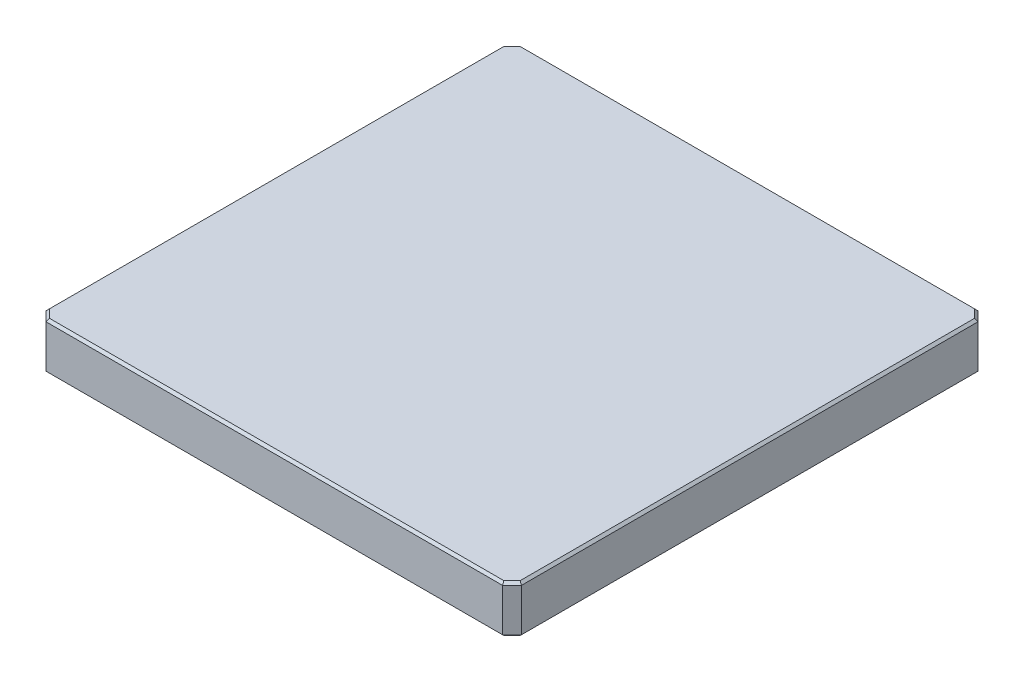
ISO-10303-21;
HEADER;
FILE_DESCRIPTION(('STEP AP214'),'2;1');
FILE_NAME('part.step','',(''),(''),'','','');
FILE_SCHEMA(('AUTOMOTIVE_DESIGN { 1 0 10303 214 1 1 1 1 }'));
ENDSEC;
DATA;
#1=APPLICATION_CONTEXT('core data for automotive mechanical design processes');
#2=APPLICATION_PROTOCOL_DEFINITION('international standard','automotive_design',2000,#1);
#3=PRODUCT_CONTEXT('',#1,'mechanical');
#4=PRODUCT('Part','Part','',(#3));
#5=PRODUCT_RELATED_PRODUCT_CATEGORY('part','',(#4));
#6=PRODUCT_DEFINITION_FORMATION('','',#4);
#7=PRODUCT_DEFINITION_CONTEXT('part definition',#1,'design');
#8=PRODUCT_DEFINITION('design','',#6,#7);
#9=PRODUCT_DEFINITION_SHAPE('','',#8);
#10=(LENGTH_UNIT() NAMED_UNIT(*) SI_UNIT(.MILLI.,.METRE.));
#11=(NAMED_UNIT(*) PLANE_ANGLE_UNIT() SI_UNIT($,.RADIAN.));
#12=(NAMED_UNIT(*) SI_UNIT($,.STERADIAN.) SOLID_ANGLE_UNIT());
#13=UNCERTAINTY_MEASURE_WITH_UNIT(LENGTH_MEASURE(1.E-05),#10,'distance_accuracy_value','');
#14=(GEOMETRIC_REPRESENTATION_CONTEXT(3) GLOBAL_UNCERTAINTY_ASSIGNED_CONTEXT((#13)) GLOBAL_UNIT_ASSIGNED_CONTEXT((#10,
#11,#12)) REPRESENTATION_CONTEXT('',''));
#15=CARTESIAN_POINT('',(0.,0.,0.));
#16=DIRECTION('',(0.,0.,1.));
#17=DIRECTION('',(1.,0.,0.));
#18=AXIS2_PLACEMENT_3D('',#15,#16,#17);
#19=CARTESIAN_POINT('',(0.,10.,0.));
#20=DIRECTION('',(1.,0.,0.));
#21=DIRECTION('',(0.,0.,-1.));
#22=AXIS2_PLACEMENT_3D('',#19,#20,#21);
#23=PLANE('',#22);
#24=DIRECTION('',(0.,-1.,0.));
#25=VECTOR('',#24,1.);
#26=CARTESIAN_POINT('',(0.,10.,-98.));
#27=LINE('',#26,#25);
#28=CARTESIAN_POINT('',(0.,9.49999999999998,-98.));
#29=VERTEX_POINT('',#28);
#30=CARTESIAN_POINT('',(0.,0.5,-98.));
#31=VERTEX_POINT('',#30);
#32=EDGE_CURVE('E338',#29,#31,#27,.T.);
#33=ORIENTED_EDGE('',*,*,#32,.T.);
#34=DIRECTION('',(0.,0.,1.));
#35=VECTOR('',#34,1.);
#36=CARTESIAN_POINT('',(0.,0.5,-2.00000000000002));
#37=LINE('',#36,#35);
#38=CARTESIAN_POINT('',(0.,0.5,-2.00000000000002));
#39=VERTEX_POINT('',#38);
#40=EDGE_CURVE('E242',#31,#39,#37,.T.);
#41=ORIENTED_EDGE('',*,*,#40,.T.);
#42=DIRECTION('',(0.,1.,0.));
#43=VECTOR('',#42,1.);
#44=CARTESIAN_POINT('',(0.,10.,-2.00000000000002));
#45=LINE('',#44,#43);
#46=CARTESIAN_POINT('',(0.,9.49999999999999,-2.00000000000002));
#47=VERTEX_POINT('',#46);
#48=EDGE_CURVE('E288',#39,#47,#45,.T.);
#49=ORIENTED_EDGE('',*,*,#48,.T.);
#50=DIRECTION('',(0.,0.,-1.));
#51=VECTOR('',#50,1.);
#52=CARTESIAN_POINT('',(0.,9.49999999999999,0.));
#53=LINE('',#52,#51);
#54=EDGE_CURVE('E239',#47,#29,#53,.T.);
#55=ORIENTED_EDGE('',*,*,#54,.T.);
#56=EDGE_LOOP('',(#33,#41,#49,#55));
#57=FACE_BOUND('',#56,.T.);
#58=ADVANCED_FACE('F47',(#57),#23,.F.);
#59=CARTESIAN_POINT('',(0.,10.,0.));
#60=DIRECTION('',(0.,0.,-1.));
#61=DIRECTION('',(-1.,0.,0.));
#62=AXIS2_PLACEMENT_3D('',#59,#60,#61);
#63=PLANE('',#62);
#64=DIRECTION('',(0.,-1.,0.));
#65=VECTOR('',#64,1.);
#66=CARTESIAN_POINT('',(2.00000000000002,10.,0.));
#67=LINE('',#66,#65);
#68=CARTESIAN_POINT('',(2.00000000000002,9.49999999999999,0.));
#69=VERTEX_POINT('',#68);
#70=CARTESIAN_POINT('',(2.00000000000002,0.5,0.));
#71=VERTEX_POINT('',#70);
#72=EDGE_CURVE('E184',#69,#71,#67,.T.);
#73=ORIENTED_EDGE('',*,*,#72,.T.);
#74=DIRECTION('',(1.,0.,0.));
#75=VECTOR('',#74,1.);
#76=CARTESIAN_POINT('',(98.,0.5,0.));
#77=LINE('',#76,#75);
#78=CARTESIAN_POINT('',(98.,0.499999999999999,0.));
#79=VERTEX_POINT('',#78);
#80=EDGE_CURVE('E205',#71,#79,#77,.T.);
#81=ORIENTED_EDGE('',*,*,#80,.T.);
#82=DIRECTION('',(0.,1.,0.));
#83=VECTOR('',#82,1.);
#84=CARTESIAN_POINT('',(98.,10.,0.));
#85=LINE('',#84,#83);
#86=CARTESIAN_POINT('',(98.,9.49999999999999,0.));
#87=VERTEX_POINT('',#86);
#88=EDGE_CURVE('E359',#79,#87,#85,.T.);
#89=ORIENTED_EDGE('',*,*,#88,.T.);
#90=DIRECTION('',(-1.,0.,0.));
#91=VECTOR('',#90,1.);
#92=CARTESIAN_POINT('',(0.,9.49999999999999,0.));
#93=LINE('',#92,#91);
#94=EDGE_CURVE('E202',#87,#69,#93,.T.);
#95=ORIENTED_EDGE('',*,*,#94,.T.);
#96=EDGE_LOOP('',(#73,#81,#89,#95));
#97=FACE_BOUND('',#96,.T.);
#98=ADVANCED_FACE('F388',(#97),#63,.F.);
#99=CARTESIAN_POINT('',(100.,10.,0.));
#100=DIRECTION('',(-1.,0.,0.));
#101=DIRECTION('',(0.,0.,1.));
#102=AXIS2_PLACEMENT_3D('',#99,#100,#101);
#103=PLANE('',#102);
#104=DIRECTION('',(0.,-1.,0.));
#105=VECTOR('',#104,1.);
#106=CARTESIAN_POINT('',(100.,10.,-2.00000000000002));
#107=LINE('',#106,#105);
#108=CARTESIAN_POINT('',(100.,9.49999999999999,-2.00000000000002));
#109=VERTEX_POINT('',#108);
#110=CARTESIAN_POINT('',(100.,0.5,-2.00000000000002));
#111=VERTEX_POINT('',#110);
#112=EDGE_CURVE('E351',#109,#111,#107,.T.);
#113=ORIENTED_EDGE('',*,*,#112,.T.);
#114=DIRECTION('',(0.,0.,-1.));
#115=VECTOR('',#114,1.);
#116=CARTESIAN_POINT('',(100.,0.5,-98.));
#117=LINE('',#116,#115);
#118=CARTESIAN_POINT('',(100.,0.5,-98.));
#119=VERTEX_POINT('',#118);
#120=EDGE_CURVE('E217',#111,#119,#117,.T.);
#121=ORIENTED_EDGE('',*,*,#120,.T.);
#122=DIRECTION('',(0.,1.,0.));
#123=VECTOR('',#122,1.);
#124=CARTESIAN_POINT('',(100.,10.,-98.));
#125=LINE('',#124,#123);
#126=CARTESIAN_POINT('',(100.,9.49999999999999,-98.));
#127=VERTEX_POINT('',#126);
#128=EDGE_CURVE('E355',#119,#127,#125,.T.);
#129=ORIENTED_EDGE('',*,*,#128,.T.);
#130=DIRECTION('',(0.,0.,1.));
#131=VECTOR('',#130,1.);
#132=CARTESIAN_POINT('',(100.,9.49999999999999,0.));
#133=LINE('',#132,#131);
#134=EDGE_CURVE('E214',#127,#109,#133,.T.);
#135=ORIENTED_EDGE('',*,*,#134,.T.);
#136=EDGE_LOOP('',(#113,#121,#129,#135));
#137=FACE_BOUND('',#136,.T.);
#138=ADVANCED_FACE('F432',(#137),#103,.F.);
#139=CARTESIAN_POINT('',(0.,10.,-100.));
#140=DIRECTION('',(0.,0.,1.));
#141=DIRECTION('',(1.,0.,0.));
#142=AXIS2_PLACEMENT_3D('',#139,#140,#141);
#143=PLANE('',#142);
#144=DIRECTION('',(0.,-1.,0.));
#145=VECTOR('',#144,1.);
#146=CARTESIAN_POINT('',(98.,10.,-100.));
#147=LINE('',#146,#145);
#148=CARTESIAN_POINT('',(98.,9.49999999999999,-100.));
#149=VERTEX_POINT('',#148);
#150=CARTESIAN_POINT('',(98.,0.5,-100.));
#151=VERTEX_POINT('',#150);
#152=EDGE_CURVE('E341',#149,#151,#147,.T.);
#153=ORIENTED_EDGE('',*,*,#152,.T.);
#154=DIRECTION('',(-1.,0.,0.));
#155=VECTOR('',#154,1.);
#156=CARTESIAN_POINT('',(2.00000000000002,0.5,-100.));
#157=LINE('',#156,#155);
#158=CARTESIAN_POINT('',(2.00000000000002,0.500000000000004,-100.));
#159=VERTEX_POINT('',#158);
#160=EDGE_CURVE('E230',#151,#159,#157,.T.);
#161=ORIENTED_EDGE('',*,*,#160,.T.);
#162=DIRECTION('',(0.,1.,0.));
#163=VECTOR('',#162,1.);
#164=CARTESIAN_POINT('',(2.00000000000002,10.,-100.));
#165=LINE('',#164,#163);
#166=CARTESIAN_POINT('',(2.00000000000002,9.49999999999999,-100.));
#167=VERTEX_POINT('',#166);
#168=EDGE_CURVE('E347',#159,#167,#165,.T.);
#169=ORIENTED_EDGE('',*,*,#168,.T.);
#170=DIRECTION('',(1.,0.,0.));
#171=VECTOR('',#170,1.);
#172=CARTESIAN_POINT('',(0.,9.49999999999999,-100.));
#173=LINE('',#172,#171);
#174=EDGE_CURVE('E227',#167,#149,#173,.T.);
#175=ORIENTED_EDGE('',*,*,#174,.T.);
#176=EDGE_LOOP('',(#153,#161,#169,#175));
#177=FACE_BOUND('',#176,.T.);
#178=ADVANCED_FACE('F416',(#177),#143,.F.);
#179=CARTESIAN_POINT('',(0.,10.,0.));
#180=DIRECTION('',(0.,-1.,0.));
#181=DIRECTION('',(0.,0.,-1.));
#182=AXIS2_PLACEMENT_3D('',#179,#180,#181);
#183=PLANE('',#182);
#184=DIRECTION('',(0.,0.,-1.));
#185=VECTOR('',#184,1.);
#186=CARTESIAN_POINT('',(99.5,10.,0.));
#187=LINE('',#186,#185);
#188=CARTESIAN_POINT('',(99.5,10.,-2.2071067811866));
#189=VERTEX_POINT('',#188);
#190=CARTESIAN_POINT('',(99.5,10.,-97.7928932188134));
#191=VERTEX_POINT('',#190);
#192=EDGE_CURVE('E58',#189,#191,#187,.T.);
#193=ORIENTED_EDGE('',*,*,#192,.T.);
#194=DIRECTION('',(-0.707106781186545,0.,-0.70710678118655));
#195=VECTOR('',#194,1.);
#196=CARTESIAN_POINT('',(97.6464466094067,10.,-99.6464466094067));
#197=LINE('',#196,#195);
#198=CARTESIAN_POINT('',(97.7928932188134,10.,-99.5));
#199=VERTEX_POINT('',#198);
#200=EDGE_CURVE('E11',#191,#199,#197,.T.);
#201=ORIENTED_EDGE('',*,*,#200,.T.);
#202=DIRECTION('',(-1.,0.,0.));
#203=VECTOR('',#202,1.);
#204=CARTESIAN_POINT('',(0.,10.,-99.5));
#205=LINE('',#204,#203);
#206=CARTESIAN_POINT('',(2.20710678118657,10.,-99.5));
#207=VERTEX_POINT('',#206);
#208=EDGE_CURVE('E245',#199,#207,#205,.T.);
#209=ORIENTED_EDGE('',*,*,#208,.T.);
#210=DIRECTION('',(-0.70710678118655,0.,0.707106781186545));
#211=VECTOR('',#210,1.);
#212=CARTESIAN_POINT('',(0.353553390593281,10.,-97.6464466094067));
#213=LINE('',#212,#211);
#214=CARTESIAN_POINT('',(0.500000000000012,10.,-97.7928932188134));
#215=VERTEX_POINT('',#214);
#216=EDGE_CURVE('E248',#207,#215,#213,.T.);
#217=ORIENTED_EDGE('',*,*,#216,.T.);
#218=DIRECTION('',(0.,0.,1.));
#219=VECTOR('',#218,1.);
#220=CARTESIAN_POINT('',(0.500000000000014,10.,0.));
#221=LINE('',#220,#219);
#222=CARTESIAN_POINT('',(0.500000000000014,10.,-2.20710678118657));
#223=VERTEX_POINT('',#222);
#224=EDGE_CURVE('E251',#215,#223,#221,.T.);
#225=ORIENTED_EDGE('',*,*,#224,.T.);
#226=DIRECTION('',(0.707106781186548,0.,0.707106781186548));
#227=VECTOR('',#226,1.);
#228=CARTESIAN_POINT('',(2.3535533905933,10.,-0.353553390593284));
#229=LINE('',#228,#227);
#230=CARTESIAN_POINT('',(2.20710678118657,10.,-0.500000000000014));
#231=VERTEX_POINT('',#230);
#232=EDGE_CURVE('E254',#223,#231,#229,.T.);
#233=ORIENTED_EDGE('',*,*,#232,.T.);
#234=DIRECTION('',(1.,0.,0.));
#235=VECTOR('',#234,1.);
#236=CARTESIAN_POINT('',(0.,10.,-0.500000000000014));
#237=LINE('',#236,#235);
#238=CARTESIAN_POINT('',(97.7928932188134,10.,-0.500000000000014));
#239=VERTEX_POINT('',#238);
#240=EDGE_CURVE('E257',#231,#239,#237,.T.);
#241=ORIENTED_EDGE('',*,*,#240,.T.);
#242=DIRECTION('',(0.707106781186548,0.,-0.707106781186548));
#243=VECTOR('',#242,1.);
#244=CARTESIAN_POINT('',(99.6464466094067,10.,-2.35355339059331));
#245=LINE('',#244,#243);
#246=EDGE_CURVE('E69',#239,#189,#245,.T.);
#247=ORIENTED_EDGE('',*,*,#246,.T.);
#248=EDGE_LOOP('',(#193,#201,#209,#217,#225,#233,#241,#247));
#249=FACE_BOUND('',#248,.T.);
#250=ADVANCED_FACE('F404',(#249),#183,.F.);
#251=CARTESIAN_POINT('',(0.,0.,0.));
#252=DIRECTION('',(0.,-1.,0.));
#253=DIRECTION('',(0.,0.,-1.));
#254=AXIS2_PLACEMENT_3D('',#251,#252,#253);
#255=PLANE('',#254);
#256=DIRECTION('',(-1.,0.,0.));
#257=VECTOR('',#256,1.);
#258=CARTESIAN_POINT('',(2.00000000000002,0.,-0.5));
#259=LINE('',#258,#257);
#260=CARTESIAN_POINT('',(97.7928932188134,0.,-0.500000000000002));
#261=VERTEX_POINT('',#260);
#262=CARTESIAN_POINT('',(2.20710678118656,0.,-0.5));
#263=VERTEX_POINT('',#262);
#264=EDGE_CURVE('E188',#261,#263,#259,.T.);
#265=ORIENTED_EDGE('',*,*,#264,.T.);
#266=DIRECTION('',(-0.707106781186548,0.,-0.707106781186548));
#267=VECTOR('',#266,1.);
#268=CARTESIAN_POINT('',(1.35355339059328,0.,-1.35355339059328));
#269=LINE('',#268,#267);
#270=CARTESIAN_POINT('',(0.5,0.,-2.20710678118656));
#271=VERTEX_POINT('',#270);
#272=EDGE_CURVE('E167',#263,#271,#269,.T.);
#273=ORIENTED_EDGE('',*,*,#272,.T.);
#274=DIRECTION('',(0.,0.,-1.));
#275=VECTOR('',#274,1.);
#276=CARTESIAN_POINT('',(0.5,0.,-98.));
#277=LINE('',#276,#275);
#278=CARTESIAN_POINT('',(0.5,0.,-97.7928932188134));
#279=VERTEX_POINT('',#278);
#280=EDGE_CURVE('E176',#271,#279,#277,.T.);
#281=ORIENTED_EDGE('',*,*,#280,.T.);
#282=DIRECTION('',(0.70710678118655,0.,-0.707106781186545));
#283=VECTOR('',#282,1.);
#284=CARTESIAN_POINT('',(-48.6464466094067,0.,-48.6464466094071));
#285=LINE('',#284,#283);
#286=CARTESIAN_POINT('',(2.20710678118658,0.,-99.5));
#287=VERTEX_POINT('',#286);
#288=EDGE_CURVE('E183',#279,#287,#285,.T.);
#289=ORIENTED_EDGE('',*,*,#288,.T.);
#290=DIRECTION('',(1.,0.,0.));
#291=VECTOR('',#290,1.);
#292=CARTESIAN_POINT('',(98.,0.,-99.5));
#293=LINE('',#292,#291);
#294=CARTESIAN_POINT('',(97.7928932188134,0.,-99.5));
#295=VERTEX_POINT('',#294);
#296=EDGE_CURVE('E367',#287,#295,#293,.T.);
#297=ORIENTED_EDGE('',*,*,#296,.T.);
#298=DIRECTION('',(0.707106781186545,0.,0.70710678118655));
#299=VECTOR('',#298,1.);
#300=CARTESIAN_POINT('',(98.6464466094071,0.,-98.6464466094064));
#301=LINE('',#300,#299);
#302=CARTESIAN_POINT('',(99.5,0.,-97.7928932188134));
#303=VERTEX_POINT('',#302);
#304=EDGE_CURVE('E370',#295,#303,#301,.T.);
#305=ORIENTED_EDGE('',*,*,#304,.T.);
#306=DIRECTION('',(0.,0.,1.));
#307=VECTOR('',#306,1.);
#308=CARTESIAN_POINT('',(99.5,0.,-2.00000000000002));
#309=LINE('',#308,#307);
#310=CARTESIAN_POINT('',(99.5,0.,-2.20710678118656));
#311=VERTEX_POINT('',#310);
#312=EDGE_CURVE('E373',#303,#311,#309,.T.);
#313=ORIENTED_EDGE('',*,*,#312,.T.);
#314=DIRECTION('',(-0.707106781186548,0.,0.707106781186548));
#315=VECTOR('',#314,1.);
#316=CARTESIAN_POINT('',(48.6464466094067,0.,48.6464466094067));
#317=LINE('',#316,#315);
#318=EDGE_CURVE('E196',#311,#261,#317,.T.);
#319=ORIENTED_EDGE('',*,*,#318,.T.);
#320=EDGE_LOOP('',(#265,#273,#281,#289,#297,#305,#313,#319));
#321=FACE_BOUND('',#320,.T.);
#322=ADVANCED_FACE('F186',(#321),#255,.T.);
#323=CARTESIAN_POINT('',(0.,10.,-98.));
#324=DIRECTION('',(0.707106781186545,0.,0.70710678118655));
#325=DIRECTION('',(0.,-1.,0.));
#326=AXIS2_PLACEMENT_3D('',#323,#324,#325);
#327=PLANE('',#326);
#328=ORIENTED_EDGE('',*,*,#168,.F.);
#329=DIRECTION('',(0.70710678118655,0.,-0.707106781186545));
#330=VECTOR('',#329,1.);
#331=CARTESIAN_POINT('',(0.,0.500000000000004,-98.));
#332=LINE('',#331,#330);
#333=EDGE_CURVE('E236',#159,#31,#332,.F.);
#334=ORIENTED_EDGE('',*,*,#333,.T.);
#335=ORIENTED_EDGE('',*,*,#32,.F.);
#336=DIRECTION('',(-0.70710678118655,0.,0.707106781186545));
#337=VECTOR('',#336,1.);
#338=CARTESIAN_POINT('',(2.00000000000002,9.49999999999998,-100.));
#339=LINE('',#338,#337);
#340=EDGE_CURVE('E233',#29,#167,#339,.F.);
#341=ORIENTED_EDGE('',*,*,#340,.T.);
#342=EDGE_LOOP('',(#328,#334,#335,#341));
#343=FACE_BOUND('',#342,.T.);
#344=ADVANCED_FACE('F447',(#343),#327,.F.);
#345=CARTESIAN_POINT('',(98.,10.,-100.));
#346=DIRECTION('',(-0.70710678118655,0.,0.707106781186545));
#347=DIRECTION('',(0.,-1.,0.));
#348=AXIS2_PLACEMENT_3D('',#345,#346,#347);
#349=PLANE('',#348);
#350=ORIENTED_EDGE('',*,*,#128,.F.);
#351=DIRECTION('',(0.707106781186545,0.,0.70710678118655));
#352=VECTOR('',#351,1.);
#353=CARTESIAN_POINT('',(98.,0.5,-100.));
#354=LINE('',#353,#352);
#355=EDGE_CURVE('E224',#119,#151,#354,.F.);
#356=ORIENTED_EDGE('',*,*,#355,.T.);
#357=ORIENTED_EDGE('',*,*,#152,.F.);
#358=DIRECTION('',(-0.707106781186545,0.,-0.70710678118655));
#359=VECTOR('',#358,1.);
#360=CARTESIAN_POINT('',(100.,9.49999999999999,-98.));
#361=LINE('',#360,#359);
#362=EDGE_CURVE('E220',#149,#127,#361,.F.);
#363=ORIENTED_EDGE('',*,*,#362,.T.);
#364=EDGE_LOOP('',(#350,#356,#357,#363));
#365=FACE_BOUND('',#364,.T.);
#366=ADVANCED_FACE('F421',(#365),#349,.F.);
#367=CARTESIAN_POINT('',(2.00000000000002,10.,0.));
#368=DIRECTION('',(0.707106781186547,0.,-0.707106781186547));
#369=DIRECTION('',(0.,-1.,0.));
#370=AXIS2_PLACEMENT_3D('',#367,#368,#369);
#371=PLANE('',#370);
#372=ORIENTED_EDGE('',*,*,#48,.F.);
#373=DIRECTION('',(-0.707106781186548,0.,-0.707106781186548));
#374=VECTOR('',#373,1.);
#375=CARTESIAN_POINT('',(2.00000000000002,0.5,0.));
#376=LINE('',#375,#374);
#377=EDGE_CURVE('E169',#39,#71,#376,.F.);
#378=ORIENTED_EDGE('',*,*,#377,.T.);
#379=ORIENTED_EDGE('',*,*,#72,.F.);
#380=DIRECTION('',(0.707106781186548,0.,0.707106781186548));
#381=VECTOR('',#380,1.);
#382=CARTESIAN_POINT('',(0.,9.49999999999999,-2.00000000000002));
#383=LINE('',#382,#381);
#384=EDGE_CURVE('E191',#69,#47,#383,.F.);
#385=ORIENTED_EDGE('',*,*,#384,.T.);
#386=EDGE_LOOP('',(#372,#378,#379,#385));
#387=FACE_BOUND('',#386,.T.);
#388=ADVANCED_FACE('F332',(#387),#371,.F.);
#389=CARTESIAN_POINT('',(100.,10.,-2.00000000000002));
#390=DIRECTION('',(-0.707106781186547,0.,-0.707106781186547));
#391=DIRECTION('',(0.,-1.,0.));
#392=AXIS2_PLACEMENT_3D('',#389,#390,#391);
#393=PLANE('',#392);
#394=ORIENTED_EDGE('',*,*,#88,.F.);
#395=DIRECTION('',(-0.707106781186548,0.,0.707106781186548));
#396=VECTOR('',#395,1.);
#397=CARTESIAN_POINT('',(100.,0.499999999999999,-2.00000000000002));
#398=LINE('',#397,#396);
#399=EDGE_CURVE('E211',#79,#111,#398,.F.);
#400=ORIENTED_EDGE('',*,*,#399,.T.);
#401=ORIENTED_EDGE('',*,*,#112,.F.);
#402=DIRECTION('',(0.707106781186548,0.,-0.707106781186548));
#403=VECTOR('',#402,1.);
#404=CARTESIAN_POINT('',(98.,9.49999999999999,0.));
#405=LINE('',#404,#403);
#406=EDGE_CURVE('E208',#109,#87,#405,.F.);
#407=ORIENTED_EDGE('',*,*,#406,.T.);
#408=EDGE_LOOP('',(#394,#400,#401,#407));
#409=FACE_BOUND('',#408,.T.);
#410=ADVANCED_FACE('F390',(#409),#393,.F.);
#411=CARTESIAN_POINT('',(98.6464466094071,0.,-98.6464466094064));
#412=DIRECTION('',(0.499999999999991,-0.707106781186563,-0.499999999999987));
#413=DIRECTION('',(-0.707106781186545,0.,-0.70710678118655));
#414=AXIS2_PLACEMENT_3D('',#411,#412,#413);
#415=PLANE('',#414);
#416=DIRECTION('',(-0.281084637714861,-0.678598344545839,0.678598344545839));
#417=VECTOR('',#416,1.);
#418=CARTESIAN_POINT('',(90.2571597911891,-18.192869843396,-81.307130156604));
#419=LINE('',#418,#417);
#420=EDGE_CURVE('E280',#151,#295,#419,.T.);
#421=ORIENTED_EDGE('',*,*,#420,.F.);
#422=ORIENTED_EDGE('',*,*,#355,.F.);
#423=DIRECTION('',(-0.678598344545839,-0.678598344545839,0.281084637714858));
#424=VECTOR('',#423,1.);
#425=CARTESIAN_POINT('',(99.2697521433899,-0.230247856610065,-97.6975214338982));
#426=LINE('',#425,#424);
#427=EDGE_CURVE('E284',#303,#119,#426,.F.);
#428=ORIENTED_EDGE('',*,*,#427,.F.);
#429=ORIENTED_EDGE('',*,*,#304,.F.);
#430=EDGE_LOOP('',(#421,#422,#428,#429));
#431=FACE_BOUND('',#430,.T.);
#432=ADVANCED_FACE('F425',(#431),#415,.T.);
#433=CARTESIAN_POINT('',(100.,0.5,0.));
#434=DIRECTION('',(0.707106781186547,-0.707106781186547,0.));
#435=DIRECTION('',(0.,0.,1.));
#436=AXIS2_PLACEMENT_3D('',#433,#434,#435);
#437=PLANE('',#436);
#438=ORIENTED_EDGE('',*,*,#427,.T.);
#439=ORIENTED_EDGE('',*,*,#120,.F.);
#440=DIRECTION('',(-0.678598344545847,-0.678598344545847,-0.28108463771482));
#441=VECTOR('',#440,1.);
#442=CARTESIAN_POINT('',(100.381487139661,0.881487139661096,-1.84198285288147));
#443=LINE('',#442,#441);
#444=EDGE_CURVE('E276',#311,#111,#443,.F.);
#445=ORIENTED_EDGE('',*,*,#444,.F.);
#446=ORIENTED_EDGE('',*,*,#312,.F.);
#447=EDGE_LOOP('',(#438,#439,#445,#446));
#448=FACE_BOUND('',#447,.T.);
#449=ADVANCED_FACE('F430',(#448),#437,.T.);
#450=CARTESIAN_POINT('',(0.,0.5,-100.));
#451=DIRECTION('',(0.,-0.707106781186547,-0.707106781186547));
#452=DIRECTION('',(1.,0.,0.));
#453=AXIS2_PLACEMENT_3D('',#450,#451,#452);
#454=PLANE('',#453);
#455=ORIENTED_EDGE('',*,*,#420,.T.);
#456=ORIENTED_EDGE('',*,*,#296,.F.);
#457=DIRECTION('',(0.281084637714831,-0.678598344545845,0.678598344545845));
#458=VECTOR('',#457,1.);
#459=CARTESIAN_POINT('',(7.88922837966555,-13.7178550261004,-85.7821449738996));
#460=LINE('',#459,#458);
#461=EDGE_CURVE('E272',#159,#287,#460,.T.);
#462=ORIENTED_EDGE('',*,*,#461,.F.);
#463=ORIENTED_EDGE('',*,*,#160,.F.);
#464=EDGE_LOOP('',(#455,#456,#462,#463));
#465=FACE_BOUND('',#464,.T.);
#466=ADVANCED_FACE('F497',(#465),#454,.T.);
#467=CARTESIAN_POINT('',(48.6464466094067,0.,48.6464466094067));
#468=DIRECTION('',(0.5,-0.707106781186547,0.5));
#469=DIRECTION('',(0.707106781186548,0.,-0.707106781186548));
#470=AXIS2_PLACEMENT_3D('',#467,#468,#469);
#471=PLANE('',#470);
#472=ORIENTED_EDGE('',*,*,#444,.T.);
#473=ORIENTED_EDGE('',*,*,#399,.F.);
#474=DIRECTION('',(-0.28108463771482,-0.678598344545847,-0.678598344545847));
#475=VECTOR('',#474,1.);
#476=CARTESIAN_POINT('',(103.284271247462,13.2573593128807,12.7573593128807));
#477=LINE('',#476,#475);
#478=EDGE_CURVE('E268',#261,#79,#477,.F.);
#479=ORIENTED_EDGE('',*,*,#478,.F.);
#480=ORIENTED_EDGE('',*,*,#318,.F.);
#481=EDGE_LOOP('',(#472,#473,#479,#480));
#482=FACE_BOUND('',#481,.T.);
#483=ADVANCED_FACE('F382',(#482),#471,.T.);
#484=CARTESIAN_POINT('',(-48.6464466094067,0.,-48.6464466094071));
#485=DIRECTION('',(-0.499999999999995,-0.707106781186552,-0.499999999999998));
#486=DIRECTION('',(-0.70710678118655,0.,0.707106781186545));
#487=AXIS2_PLACEMENT_3D('',#484,#485,#486);
#488=PLANE('',#487);
#489=ORIENTED_EDGE('',*,*,#461,.T.);
#490=ORIENTED_EDGE('',*,*,#288,.F.);
#491=DIRECTION('',(0.678598344545844,-0.678598344545844,0.281084637714834));
#492=VECTOR('',#491,1.);
#493=CARTESIAN_POINT('',(18.6928698433943,-18.1928698433943,-90.2571597911906));
#494=LINE('',#493,#492);
#495=EDGE_CURVE('E179',#31,#279,#494,.T.);
#496=ORIENTED_EDGE('',*,*,#495,.F.);
#497=ORIENTED_EDGE('',*,*,#333,.F.);
#498=EDGE_LOOP('',(#489,#490,#496,#497));
#499=FACE_BOUND('',#498,.T.);
#500=ADVANCED_FACE('F485',(#499),#488,.T.);
#501=CARTESIAN_POINT('',(0.,0.5,0.));
#502=DIRECTION('',(0.,-0.707106781186547,0.707106781186547));
#503=DIRECTION('',(-1.,0.,0.));
#504=AXIS2_PLACEMENT_3D('',#501,#502,#503);
#505=PLANE('',#504);
#506=ORIENTED_EDGE('',*,*,#478,.T.);
#507=ORIENTED_EDGE('',*,*,#80,.F.);
#508=DIRECTION('',(0.281084637714821,-0.678598344545847,-0.678598344545847));
#509=VECTOR('',#508,1.);
#510=CARTESIAN_POINT('',(1.84198285288147,0.881487139661096,0.381487139661096));
#511=LINE('',#510,#509);
#512=EDGE_CURVE('E173',#263,#71,#511,.F.);
#513=ORIENTED_EDGE('',*,*,#512,.F.);
#514=ORIENTED_EDGE('',*,*,#264,.F.);
#515=EDGE_LOOP('',(#506,#507,#513,#514));
#516=FACE_BOUND('',#515,.T.);
#517=ADVANCED_FACE('F385',(#516),#505,.T.);
#518=CARTESIAN_POINT('',(0.,0.5,0.));
#519=DIRECTION('',(-0.707106781186547,-0.707106781186547,0.));
#520=DIRECTION('',(0.,0.,-1.));
#521=AXIS2_PLACEMENT_3D('',#518,#519,#520);
#522=PLANE('',#521);
#523=ORIENTED_EDGE('',*,*,#495,.T.);
#524=ORIENTED_EDGE('',*,*,#280,.F.);
#525=DIRECTION('',(-0.678598344545847,0.678598344545847,0.281084637714821));
#526=VECTOR('',#525,1.);
#527=CARTESIAN_POINT('',(-0.381487139661096,0.881487139661096,-1.84198285288147));
#528=LINE('',#527,#526);
#529=EDGE_CURVE('E163',#39,#271,#528,.F.);
#530=ORIENTED_EDGE('',*,*,#529,.F.);
#531=ORIENTED_EDGE('',*,*,#40,.F.);
#532=EDGE_LOOP('',(#523,#524,#530,#531));
#533=FACE_BOUND('',#532,.T.);
#534=ADVANCED_FACE('F177',(#533),#522,.T.);
#535=CARTESIAN_POINT('',(1.35355339059328,0.,-1.35355339059328));
#536=DIRECTION('',(-0.5,-0.707106781186548,0.5));
#537=DIRECTION('',(0.707106781186548,0.,0.707106781186548));
#538=AXIS2_PLACEMENT_3D('',#535,#536,#537);
#539=PLANE('',#538);
#540=ORIENTED_EDGE('',*,*,#512,.T.);
#541=ORIENTED_EDGE('',*,*,#377,.F.);
#542=ORIENTED_EDGE('',*,*,#529,.T.);
#543=ORIENTED_EDGE('',*,*,#272,.F.);
#544=EDGE_LOOP('',(#540,#541,#542,#543));
#545=FACE_BOUND('',#544,.T.);
#546=ADVANCED_FACE('F165',(#545),#539,.T.);
#547=CARTESIAN_POINT('',(1.35355339059329,10.,-1.35355339059329));
#548=DIRECTION('',(0.5,-0.707106781186547,-0.5));
#549=DIRECTION('',(0.707106781186548,0.,0.707106781186548));
#550=AXIS2_PLACEMENT_3D('',#547,#548,#549);
#551=PLANE('',#550);
#552=DIRECTION('',(0.678598344545847,0.678598344545847,-0.281084637714819));
#553=VECTOR('',#552,1.);
#554=CARTESIAN_POINT('',(0.0790085735592834,9.57900857355927,-2.03272642271202));
#555=LINE('',#554,#553);
#556=EDGE_CURVE('E310',#47,#223,#555,.T.);
#557=ORIENTED_EDGE('',*,*,#556,.F.);
#558=ORIENTED_EDGE('',*,*,#384,.F.);
#559=DIRECTION('',(0.281084637714819,0.678598344545847,-0.678598344545847));
#560=VECTOR('',#559,1.);
#561=CARTESIAN_POINT('',(2.30247856610184,10.2302478566102,-0.730247856610198));
#562=LINE('',#561,#560);
#563=EDGE_CURVE('E52',#231,#69,#562,.F.);
#564=ORIENTED_EDGE('',*,*,#563,.F.);
#565=ORIENTED_EDGE('',*,*,#232,.F.);
#566=EDGE_LOOP('',(#557,#558,#564,#565));
#567=FACE_BOUND('',#566,.T.);
#568=ADVANCED_FACE('F50',(#567),#551,.F.);
#569=CARTESIAN_POINT('',(0.,10.,-0.500000000000014));
#570=DIRECTION('',(0.,-0.707106781186548,-0.707106781186548));
#571=DIRECTION('',(1.,0.,0.));
#572=AXIS2_PLACEMENT_3D('',#569,#570,#571);
#573=PLANE('',#572);
#574=ORIENTED_EDGE('',*,*,#563,.T.);
#575=ORIENTED_EDGE('',*,*,#94,.F.);
#576=DIRECTION('',(-0.281084637714845,0.678598344545842,-0.678598344545842));
#577=VECTOR('',#576,1.);
#578=CARTESIAN_POINT('',(90.0664162213595,28.6533655566154,-19.1533655566154));
#579=LINE('',#578,#577);
#580=EDGE_CURVE('E307',#239,#87,#579,.F.);
#581=ORIENTED_EDGE('',*,*,#580,.F.);
#582=ORIENTED_EDGE('',*,*,#240,.F.);
#583=EDGE_LOOP('',(#574,#575,#581,#582));
#584=FACE_BOUND('',#583,.T.);
#585=ADVANCED_FACE('F323',(#584),#573,.F.);
#586=CARTESIAN_POINT('',(0.500000000000014,10.,0.));
#587=DIRECTION('',(0.707106781186548,-0.707106781186548,0.));
#588=DIRECTION('',(0.,0.,1.));
#589=AXIS2_PLACEMENT_3D('',#586,#587,#588);
#590=PLANE('',#589);
#591=ORIENTED_EDGE('',*,*,#556,.T.);
#592=ORIENTED_EDGE('',*,*,#224,.F.);
#593=DIRECTION('',(0.67859834454585,0.678598344545849,0.281084637714809));
#594=VECTOR('',#593,1.);
#595=CARTESIAN_POINT('',(-12.7573593128813,-3.25735931288128,-103.284271247462));
#596=LINE('',#595,#594);
#597=EDGE_CURVE('E303',#29,#215,#596,.T.);
#598=ORIENTED_EDGE('',*,*,#597,.F.);
#599=ORIENTED_EDGE('',*,*,#54,.F.);
#600=EDGE_LOOP('',(#591,#592,#598,#599));
#601=FACE_BOUND('',#600,.T.);
#602=ADVANCED_FACE('F538',(#601),#590,.F.);
#603=CARTESIAN_POINT('',(48.6464466094067,10.,48.6464466094067));
#604=DIRECTION('',(-0.499999999999993,-0.707106781186557,-0.499999999999993));
#605=DIRECTION('',(0.707106781186548,0.,-0.707106781186548));
#606=AXIS2_PLACEMENT_3D('',#603,#604,#605);
#607=PLANE('',#606);
#608=ORIENTED_EDGE('',*,*,#580,.T.);
#609=ORIENTED_EDGE('',*,*,#406,.F.);
#610=DIRECTION('',(-0.678598344545842,0.678598344545842,-0.281084637714845));
#611=VECTOR('',#610,1.);
#612=CARTESIAN_POINT('',(85.7821449739,23.7178550261,-7.88922837966567));
#613=LINE('',#612,#611);
#614=EDGE_CURVE('E299',#189,#109,#613,.F.);
#615=ORIENTED_EDGE('',*,*,#614,.F.);
#616=ORIENTED_EDGE('',*,*,#246,.F.);
#617=EDGE_LOOP('',(#608,#609,#615,#616));
#618=FACE_BOUND('',#617,.T.);
#619=ADVANCED_FACE('F394',(#618),#607,.F.);
#620=CARTESIAN_POINT('',(-48.6464466094067,10.,-48.6464466094071));
#621=DIRECTION('',(0.500000000000002,-0.707106781186543,0.500000000000005));
#622=DIRECTION('',(-0.70710678118655,0.,0.707106781186545));
#623=AXIS2_PLACEMENT_3D('',#620,#621,#622);
#624=PLANE('',#623);
#625=ORIENTED_EDGE('',*,*,#597,.T.);
#626=ORIENTED_EDGE('',*,*,#216,.F.);
#627=DIRECTION('',(0.281084637714807,0.67859834454585,0.67859834454585));
#628=VECTOR('',#627,1.);
#629=CARTESIAN_POINT('',(2.03272642271203,9.57900857355929,-99.9209914264407));
#630=LINE('',#629,#628);
#631=EDGE_CURVE('E295',#167,#207,#630,.T.);
#632=ORIENTED_EDGE('',*,*,#631,.F.);
#633=ORIENTED_EDGE('',*,*,#340,.F.);
#634=EDGE_LOOP('',(#625,#626,#632,#633));
#635=FACE_BOUND('',#634,.T.);
#636=ADVANCED_FACE('F409',(#635),#624,.F.);
#637=CARTESIAN_POINT('',(99.5,10.,0.));
#638=DIRECTION('',(-0.707106781186548,-0.707106781186548,0.));
#639=DIRECTION('',(0.,0.,-1.));
#640=AXIS2_PLACEMENT_3D('',#637,#638,#639);
#641=PLANE('',#640);
#642=ORIENTED_EDGE('',*,*,#614,.T.);
#643=ORIENTED_EDGE('',*,*,#134,.F.);
#644=DIRECTION('',(-0.678598344545844,0.678598344545844,0.281084637714834));
#645=VECTOR('',#644,1.);
#646=CARTESIAN_POINT('',(80.8466344433853,28.6533655566147,-90.0664162213601));
#647=LINE('',#646,#645);
#648=EDGE_CURVE('E292',#191,#127,#647,.F.);
#649=ORIENTED_EDGE('',*,*,#648,.F.);
#650=ORIENTED_EDGE('',*,*,#192,.F.);
#651=EDGE_LOOP('',(#642,#643,#649,#650));
#652=FACE_BOUND('',#651,.T.);
#653=ADVANCED_FACE('F397',(#652),#641,.F.);
#654=CARTESIAN_POINT('',(0.,10.,-99.5));
#655=DIRECTION('',(0.,-0.707106781186548,0.707106781186548));
#656=DIRECTION('',(-1.,0.,0.));
#657=AXIS2_PLACEMENT_3D('',#654,#655,#656);
#658=PLANE('',#657);
#659=ORIENTED_EDGE('',*,*,#631,.T.);
#660=ORIENTED_EDGE('',*,*,#208,.F.);
#661=DIRECTION('',(0.281084637714836,-0.678598344545844,-0.678598344545844));
#662=VECTOR('',#661,1.);
#663=CARTESIAN_POINT('',(90.0664162213599,28.6533655566149,-80.8466344433851));
#664=LINE('',#663,#662);
#665=EDGE_CURVE('E289',#149,#199,#664,.F.);
#666=ORIENTED_EDGE('',*,*,#665,.F.);
#667=ORIENTED_EDGE('',*,*,#174,.F.);
#668=EDGE_LOOP('',(#659,#660,#666,#667));
#669=FACE_BOUND('',#668,.T.);
#670=ADVANCED_FACE('F413',(#669),#658,.F.);
#671=CARTESIAN_POINT('',(98.6464466094071,10.,-98.6464466094064));
#672=DIRECTION('',(-0.499999999999998,-0.707106781186553,0.499999999999994));
#673=DIRECTION('',(-0.707106781186545,0.,-0.70710678118655));
#674=AXIS2_PLACEMENT_3D('',#671,#672,#673);
#675=PLANE('',#674);
#676=ORIENTED_EDGE('',*,*,#648,.T.);
#677=ORIENTED_EDGE('',*,*,#362,.F.);
#678=ORIENTED_EDGE('',*,*,#665,.T.);
#679=ORIENTED_EDGE('',*,*,#200,.F.);
#680=EDGE_LOOP('',(#676,#677,#678,#679));
#681=FACE_BOUND('',#680,.T.);
#682=ADVANCED_FACE('F401',(#681),#675,.F.);
#683=CLOSED_SHELL('',(#58,#98,#138,#178,#250,#322,#344,#366,#388,#410,#432,#449,#466,#483,#500,
#517,#534,#546,#568,#585,#602,#619,#636,#653,#670,#682));
#684=MANIFOLD_SOLID_BREP('B2',#683);
#685=ADVANCED_BREP_SHAPE_REPRESENTATION('',(#18,#684),#14);
#686=SHAPE_DEFINITION_REPRESENTATION(#9,#685);
ENDSEC;
END-ISO-10303-21;
